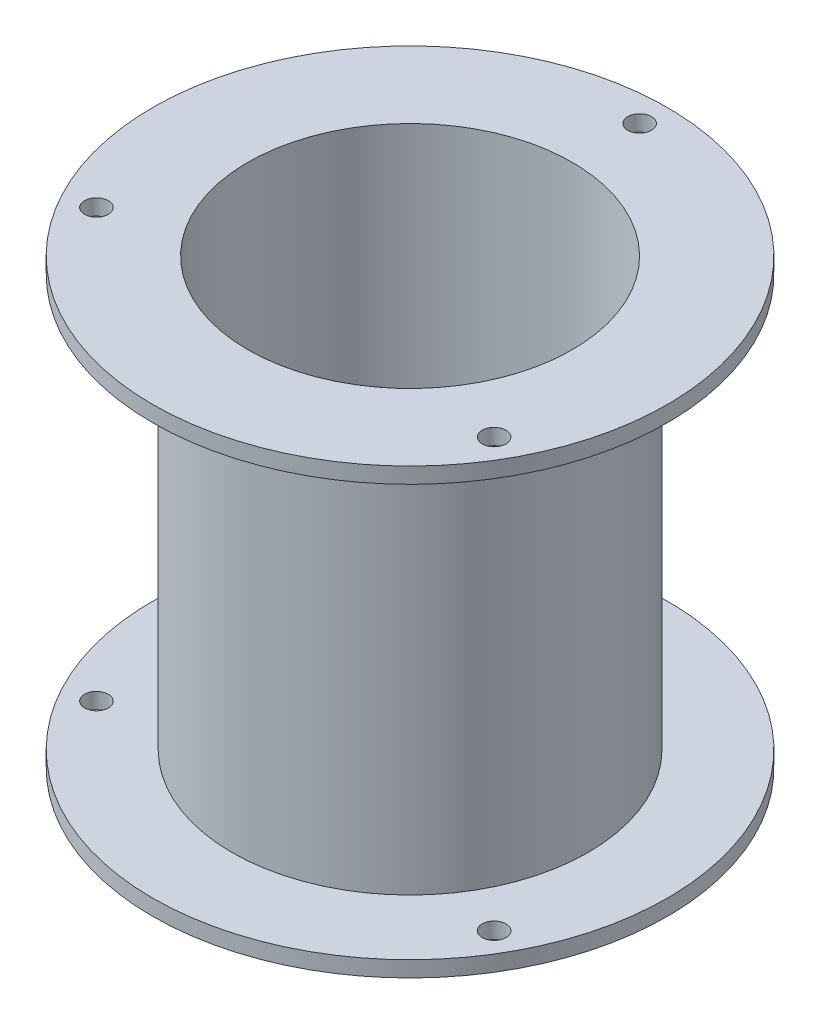
ISO-10303-21;
HEADER;
FILE_DESCRIPTION(('STEP AP214'),'2;1');
FILE_NAME('part.step','',(''),(''),'','','');
FILE_SCHEMA(('AUTOMOTIVE_DESIGN { 1 0 10303 214 1 1 1 1 }'));
ENDSEC;
DATA;
#1=APPLICATION_CONTEXT('core data for automotive mechanical design processes');
#2=APPLICATION_PROTOCOL_DEFINITION('international standard','automotive_design',2000,#1);
#3=PRODUCT_CONTEXT('',#1,'mechanical');
#4=PRODUCT('Part','Part','',(#3));
#5=PRODUCT_RELATED_PRODUCT_CATEGORY('part','',(#4));
#6=PRODUCT_DEFINITION_FORMATION('','',#4);
#7=PRODUCT_DEFINITION_CONTEXT('part definition',#1,'design');
#8=PRODUCT_DEFINITION('design','',#6,#7);
#9=PRODUCT_DEFINITION_SHAPE('','',#8);
#10=(LENGTH_UNIT() NAMED_UNIT(*) SI_UNIT(.MILLI.,.METRE.));
#11=(NAMED_UNIT(*) PLANE_ANGLE_UNIT() SI_UNIT($,.RADIAN.));
#12=(NAMED_UNIT(*) SI_UNIT($,.STERADIAN.) SOLID_ANGLE_UNIT());
#13=UNCERTAINTY_MEASURE_WITH_UNIT(LENGTH_MEASURE(1.E-05),#10,'distance_accuracy_value','');
#14=(GEOMETRIC_REPRESENTATION_CONTEXT(3) GLOBAL_UNCERTAINTY_ASSIGNED_CONTEXT((#13)) GLOBAL_UNIT_ASSIGNED_CONTEXT((#10,
#11,#12)) REPRESENTATION_CONTEXT('',''));
#15=CARTESIAN_POINT('',(0.,0.,0.));
#16=DIRECTION('',(0.,0.,1.));
#17=DIRECTION('',(1.,0.,0.));
#18=AXIS2_PLACEMENT_3D('',#15,#16,#17);
#19=CARTESIAN_POINT('',(0.,56.,0.));
#20=DIRECTION('',(0.,-1.,0.));
#21=DIRECTION('',(0.,0.,-1.));
#22=AXIS2_PLACEMENT_3D('',#19,#20,#21);
#23=CYLINDRICAL_SURFACE('',#22,32.5);
#24=CARTESIAN_POINT('',(0.,54.,0.));
#25=DIRECTION('',(0.,1.,0.));
#26=DIRECTION('',(0.,0.,1.));
#27=AXIS2_PLACEMENT_3D('',#24,#25,#26);
#28=CIRCLE('',#27,32.5);
#29=CARTESIAN_POINT('',(0.,54.,32.5));
#30=VERTEX_POINT('',#29);
#31=EDGE_CURVE('E58',#30,#30,#28,.T.);
#32=ORIENTED_EDGE('',*,*,#31,.T.);
#33=EDGE_LOOP('',(#32));
#34=FACE_BOUND('',#33,.T.);
#35=CARTESIAN_POINT('',(0.,56.,0.));
#36=DIRECTION('',(0.,1.,0.));
#37=DIRECTION('',(0.,0.,1.));
#38=AXIS2_PLACEMENT_3D('',#35,#36,#37);
#39=CIRCLE('',#38,32.5);
#40=CARTESIAN_POINT('',(0.,56.,32.5));
#41=VERTEX_POINT('',#40);
#42=EDGE_CURVE('E11',#41,#41,#39,.T.);
#43=ORIENTED_EDGE('',*,*,#42,.F.);
#44=EDGE_LOOP('',(#43));
#45=FACE_BOUND('',#44,.T.);
#46=ADVANCED_FACE('F43',(#34,#45),#23,.T.);
#47=CARTESIAN_POINT('',(0.,56.,0.));
#48=DIRECTION('',(0.,1.,0.));
#49=DIRECTION('',(0.,0.,1.));
#50=AXIS2_PLACEMENT_3D('',#47,#48,#49);
#51=PLANE('',#50);
#52=CARTESIAN_POINT('',(0.,56.,0.));
#53=DIRECTION('',(0.,1.,0.));
#54=DIRECTION('',(0.,0.,1.));
#55=AXIS2_PLACEMENT_3D('',#52,#53,#54);
#56=CIRCLE('',#55,20.5);
#57=CARTESIAN_POINT('',(0.,56.,20.5));
#58=VERTEX_POINT('',#57);
#59=EDGE_CURVE('E105',#58,#58,#56,.T.);
#60=ORIENTED_EDGE('',*,*,#59,.F.);
#61=EDGE_LOOP('',(#60));
#62=FACE_BOUND('',#61,.T.);
#63=CARTESIAN_POINT('',(0.,56.,-29.));
#64=DIRECTION('',(0.,1.,0.));
#65=DIRECTION('',(0.,0.,1.));
#66=AXIS2_PLACEMENT_3D('',#63,#64,#65);
#67=CIRCLE('',#66,1.5);
#68=CARTESIAN_POINT('',(0.,56.,-27.5));
#69=VERTEX_POINT('',#68);
#70=EDGE_CURVE('E98',#69,#69,#67,.T.);
#71=ORIENTED_EDGE('',*,*,#70,.F.);
#72=EDGE_LOOP('',(#71));
#73=FACE_BOUND('',#72,.T.);
#74=CARTESIAN_POINT('',(-25.1147367097488,56.,14.4999999999999));
#75=DIRECTION('',(0.,1.,0.));
#76=DIRECTION('',(0.,0.,1.));
#77=AXIS2_PLACEMENT_3D('',#74,#75,#76);
#78=CIRCLE('',#77,1.5);
#79=CARTESIAN_POINT('',(-25.1147367097488,56.,15.9999999999999));
#80=VERTEX_POINT('',#79);
#81=EDGE_CURVE('E95',#80,#80,#78,.T.);
#82=ORIENTED_EDGE('',*,*,#81,.F.);
#83=EDGE_LOOP('',(#82));
#84=FACE_BOUND('',#83,.T.);
#85=CARTESIAN_POINT('',(25.1147367097488,56.,14.4999999999999));
#86=DIRECTION('',(0.,1.,0.));
#87=DIRECTION('',(0.,0.,1.));
#88=AXIS2_PLACEMENT_3D('',#85,#86,#87);
#89=CIRCLE('',#88,1.5);
#90=CARTESIAN_POINT('',(25.1147367097488,56.,15.9999999999999));
#91=VERTEX_POINT('',#90);
#92=EDGE_CURVE('E88',#91,#91,#89,.T.);
#93=ORIENTED_EDGE('',*,*,#92,.F.);
#94=EDGE_LOOP('',(#93));
#95=FACE_BOUND('',#94,.T.);
#96=ORIENTED_EDGE('',*,*,#42,.T.);
#97=EDGE_LOOP('',(#96));
#98=FACE_BOUND('',#97,.T.);
#99=ADVANCED_FACE('F111',(#62,#73,#84,#95,#98),#51,.T.);
#100=CARTESIAN_POINT('',(0.,54.,0.));
#101=DIRECTION('',(0.,1.,0.));
#102=DIRECTION('',(0.,0.,1.));
#103=AXIS2_PLACEMENT_3D('',#100,#101,#102);
#104=PLANE('',#103);
#105=CARTESIAN_POINT('',(0.,54.,-29.));
#106=DIRECTION('',(0.,1.,0.));
#107=DIRECTION('',(0.,0.,1.));
#108=AXIS2_PLACEMENT_3D('',#105,#106,#107);
#109=CIRCLE('',#108,1.5);
#110=CARTESIAN_POINT('',(0.,54.,-27.5));
#111=VERTEX_POINT('',#110);
#112=EDGE_CURVE('E64',#111,#111,#109,.T.);
#113=ORIENTED_EDGE('',*,*,#112,.T.);
#114=EDGE_LOOP('',(#113));
#115=FACE_BOUND('',#114,.T.);
#116=CARTESIAN_POINT('',(-25.1147367097488,54.,14.4999999999999));
#117=DIRECTION('',(0.,1.,0.));
#118=DIRECTION('',(0.,0.,1.));
#119=AXIS2_PLACEMENT_3D('',#116,#117,#118);
#120=CIRCLE('',#119,1.5);
#121=CARTESIAN_POINT('',(-25.1147367097488,54.,15.9999999999999));
#122=VERTEX_POINT('',#121);
#123=EDGE_CURVE('E72',#122,#122,#120,.T.);
#124=ORIENTED_EDGE('',*,*,#123,.T.);
#125=EDGE_LOOP('',(#124));
#126=FACE_BOUND('',#125,.T.);
#127=CARTESIAN_POINT('',(25.1147367097488,54.,14.4999999999999));
#128=DIRECTION('',(0.,1.,0.));
#129=DIRECTION('',(0.,0.,1.));
#130=AXIS2_PLACEMENT_3D('',#127,#128,#129);
#131=CIRCLE('',#130,1.5);
#132=CARTESIAN_POINT('',(25.1147367097488,54.,15.9999999999999));
#133=VERTEX_POINT('',#132);
#134=EDGE_CURVE('E78',#133,#133,#131,.T.);
#135=ORIENTED_EDGE('',*,*,#134,.T.);
#136=EDGE_LOOP('',(#135));
#137=FACE_BOUND('',#136,.T.);
#138=CARTESIAN_POINT('',(0.,54.,0.));
#139=DIRECTION('',(0.,1.,0.));
#140=DIRECTION('',(0.,0.,1.));
#141=AXIS2_PLACEMENT_3D('',#138,#139,#140);
#142=CIRCLE('',#141,22.5);
#143=CARTESIAN_POINT('',(0.,54.,22.5));
#144=VERTEX_POINT('',#143);
#145=EDGE_CURVE('E61',#144,#144,#142,.T.);
#146=ORIENTED_EDGE('',*,*,#145,.T.);
#147=EDGE_LOOP('',(#146));
#148=FACE_BOUND('',#147,.T.);
#149=ORIENTED_EDGE('',*,*,#31,.F.);
#150=EDGE_LOOP('',(#149));
#151=FACE_BOUND('',#150,.T.);
#152=ADVANCED_FACE('F114',(#115,#126,#137,#148,#151),#104,.F.);
#153=CARTESIAN_POINT('',(0.,-91.9238815542512,0.));
#154=DIRECTION('',(0.,1.,0.));
#155=DIRECTION('',(0.,0.,1.));
#156=AXIS2_PLACEMENT_3D('',#153,#154,#155);
#157=CYLINDRICAL_SURFACE('',#156,22.5);
#158=CARTESIAN_POINT('',(0.,2.,0.));
#159=DIRECTION('',(0.,1.,0.));
#160=DIRECTION('',(0.,0.,1.));
#161=AXIS2_PLACEMENT_3D('',#158,#159,#160);
#162=CIRCLE('',#161,22.5);
#163=CARTESIAN_POINT('',(0.,1.99999999999999,22.5));
#164=VERTEX_POINT('',#163);
#165=EDGE_CURVE('E53',#164,#164,#162,.F.);
#166=CARTESIAN_POINT('',(0.,1.99999999999999,22.5));
#167=CARTESIAN_POINT('',(0.,2.54166666666665,22.5));
#168=CARTESIAN_POINT('',(0.,3.08333333333332,22.5));
#169=CARTESIAN_POINT('',(0.,4.16666666666666,22.5));
#170=CARTESIAN_POINT('',(0.,4.70833333333332,22.5));
#171=CARTESIAN_POINT('',(0.,5.79166666666666,22.5));
#172=CARTESIAN_POINT('',(0.,6.33333333333333,22.5));
#173=CARTESIAN_POINT('',(0.,7.41666666666666,22.5));
#174=CARTESIAN_POINT('',(0.,7.95833333333333,22.5));
#175=CARTESIAN_POINT('',(0.,9.04166666666666,22.5));
#176=CARTESIAN_POINT('',(0.,9.58333333333333,22.5));
#177=CARTESIAN_POINT('',(0.,10.6666666666667,22.5));
#178=CARTESIAN_POINT('',(0.,11.2083333333333,22.5));
#179=CARTESIAN_POINT('',(0.,12.2916666666667,22.5));
#180=CARTESIAN_POINT('',(0.,12.8333333333333,22.5));
#181=CARTESIAN_POINT('',(0.,13.9166666666667,22.5));
#182=CARTESIAN_POINT('',(0.,14.4583333333333,22.5));
#183=CARTESIAN_POINT('',(0.,15.5416666666667,22.5));
#184=CARTESIAN_POINT('',(0.,16.0833333333333,22.5));
#185=CARTESIAN_POINT('',(0.,17.1666666666667,22.5));
#186=CARTESIAN_POINT('',(0.,17.7083333333333,22.5));
#187=CARTESIAN_POINT('',(0.,18.7916666666667,22.5));
#188=CARTESIAN_POINT('',(0.,19.3333333333333,22.5));
#189=CARTESIAN_POINT('',(0.,20.4166666666667,22.5));
#190=CARTESIAN_POINT('',(0.,20.9583333333333,22.5));
#191=CARTESIAN_POINT('',(0.,22.0416666666667,22.5));
#192=CARTESIAN_POINT('',(0.,22.5833333333333,22.5));
#193=CARTESIAN_POINT('',(0.,23.6666666666667,22.5));
#194=CARTESIAN_POINT('',(0.,24.2083333333333,22.5));
#195=CARTESIAN_POINT('',(0.,25.2916666666667,22.5));
#196=CARTESIAN_POINT('',(0.,25.8333333333333,22.5));
#197=CARTESIAN_POINT('',(0.,26.9166666666667,22.5));
#198=CARTESIAN_POINT('',(0.,27.4583333333333,22.5));
#199=CARTESIAN_POINT('',(0.,28.5416666666667,22.5));
#200=CARTESIAN_POINT('',(0.,29.0833333333333,22.5));
#201=CARTESIAN_POINT('',(0.,30.1666666666667,22.5));
#202=CARTESIAN_POINT('',(0.,30.7083333333333,22.5));
#203=CARTESIAN_POINT('',(0.,31.7916666666667,22.5));
#204=CARTESIAN_POINT('',(0.,32.3333333333333,22.5));
#205=CARTESIAN_POINT('',(0.,33.4166666666667,22.5));
#206=CARTESIAN_POINT('',(0.,33.9583333333333,22.5));
#207=CARTESIAN_POINT('',(0.,35.0416666666667,22.5));
#208=CARTESIAN_POINT('',(0.,35.5833333333333,22.5));
#209=CARTESIAN_POINT('',(0.,36.6666666666667,22.5));
#210=CARTESIAN_POINT('',(0.,37.2083333333333,22.5));
#211=CARTESIAN_POINT('',(0.,38.2916666666667,22.5));
#212=CARTESIAN_POINT('',(0.,38.8333333333333,22.5));
#213=CARTESIAN_POINT('',(0.,39.9166666666667,22.5));
#214=CARTESIAN_POINT('',(0.,40.4583333333333,22.5));
#215=CARTESIAN_POINT('',(0.,41.5416666666667,22.5));
#216=CARTESIAN_POINT('',(0.,42.0833333333333,22.5));
#217=CARTESIAN_POINT('',(0.,43.1666666666667,22.5));
#218=CARTESIAN_POINT('',(0.,43.7083333333333,22.5));
#219=CARTESIAN_POINT('',(0.,44.7916666666667,22.5));
#220=CARTESIAN_POINT('',(0.,45.3333333333334,22.5));
#221=CARTESIAN_POINT('',(0.,46.4166666666667,22.5));
#222=CARTESIAN_POINT('',(0.,46.9583333333333,22.5));
#223=CARTESIAN_POINT('',(0.,48.0416666666667,22.5));
#224=CARTESIAN_POINT('',(0.,48.5833333333333,22.5));
#225=CARTESIAN_POINT('',(0.,49.6666666666667,22.5));
#226=CARTESIAN_POINT('',(0.,50.2083333333333,22.5));
#227=CARTESIAN_POINT('',(0.,51.2916666666667,22.5));
#228=CARTESIAN_POINT('',(0.,51.8333333333334,22.5));
#229=CARTESIAN_POINT('',(0.,52.9166666666667,22.5));
#230=CARTESIAN_POINT('',(0.,53.4583333333334,22.5));
#231=CARTESIAN_POINT('',(0.,54.,22.5));
#232=B_SPLINE_CURVE_WITH_KNOTS('',3,(#166,#167,#168,#169,#170,#171,#172,#173,#174,#175,#176,
#177,#178,#179,#180,#181,#182,#183,#184,#185,#186,#187,#188,#189,#190,#191,#192,#193,#194,#195,
#196,#197,#198,#199,#200,#201,#202,#203,#204,#205,#206,#207,#208,#209,#210,#211,#212,#213,#214,
#215,#216,#217,#218,#219,#220,#221,#222,#223,#224,#225,#226,#227,#228,#229,#230,#231),
.UNSPECIFIED.,.F.,.F.,(4,2,2,2,2,2,2,2,2,2,2,2,2,2,2,2,2,2,2,2,2,2,2,2,2,2,2,2,2,2,2,2,4),(0.,
1.625,3.25,4.875,6.50000000000001,8.12500000000001,9.75000000000001,11.375,13.,14.625,16.25,
17.875,19.5,21.125,22.75,24.375,26.,27.625,29.25,30.875,32.5,34.125,35.75,37.375,39.,40.625,
42.25,43.875,45.5,47.125,48.75,50.375,52.),.UNSPECIFIED.);
#233=EDGE_CURVE('BSEAM133',#164,#144,#232,.T.);
#234=ORIENTED_EDGE('',*,*,#165,.F.);
#235=ORIENTED_EDGE('',*,*,#145,.F.);
#236=ORIENTED_EDGE('',*,*,#233,.T.);
#237=ORIENTED_EDGE('',*,*,#233,.F.);
#238=EDGE_LOOP('',(#234,#236,#235,#237));
#239=FACE_BOUND('',#238,.T.);
#240=ADVANCED_FACE('F133',(#239),#157,.T.);
#241=CARTESIAN_POINT('',(0.,2.,0.));
#242=DIRECTION('',(0.,1.,0.));
#243=DIRECTION('',(0.,0.,1.));
#244=AXIS2_PLACEMENT_3D('',#241,#242,#243);
#245=PLANE('',#244);
#246=CARTESIAN_POINT('',(0.,2.,-29.));
#247=DIRECTION('',(0.,1.,0.));
#248=DIRECTION('',(0.,0.,1.));
#249=AXIS2_PLACEMENT_3D('',#246,#247,#248);
#250=CIRCLE('',#249,1.5);
#251=CARTESIAN_POINT('',(0.,2.,-27.5));
#252=VERTEX_POINT('',#251);
#253=EDGE_CURVE('E69',#252,#252,#250,.T.);
#254=ORIENTED_EDGE('',*,*,#253,.F.);
#255=EDGE_LOOP('',(#254));
#256=FACE_BOUND('',#255,.T.);
#257=CARTESIAN_POINT('',(-25.1147367097488,2.,14.4999999999999));
#258=DIRECTION('',(0.,1.,0.));
#259=DIRECTION('',(0.,0.,1.));
#260=AXIS2_PLACEMENT_3D('',#257,#258,#259);
#261=CIRCLE('',#260,1.5);
#262=CARTESIAN_POINT('',(-25.1147367097488,2.,15.9999999999999));
#263=VERTEX_POINT('',#262);
#264=EDGE_CURVE('E75',#263,#263,#261,.T.);
#265=ORIENTED_EDGE('',*,*,#264,.F.);
#266=EDGE_LOOP('',(#265));
#267=FACE_BOUND('',#266,.T.);
#268=CARTESIAN_POINT('',(25.1147367097488,2.,14.4999999999999));
#269=DIRECTION('',(0.,1.,0.));
#270=DIRECTION('',(0.,0.,1.));
#271=AXIS2_PLACEMENT_3D('',#268,#269,#270);
#272=CIRCLE('',#271,1.5);
#273=CARTESIAN_POINT('',(25.1147367097488,2.,15.9999999999999));
#274=VERTEX_POINT('',#273);
#275=EDGE_CURVE('E81',#274,#274,#272,.T.);
#276=ORIENTED_EDGE('',*,*,#275,.F.);
#277=EDGE_LOOP('',(#276));
#278=FACE_BOUND('',#277,.T.);
#279=CARTESIAN_POINT('',(0.,2.,0.));
#280=DIRECTION('',(0.,1.,0.));
#281=DIRECTION('',(0.,0.,1.));
#282=AXIS2_PLACEMENT_3D('',#279,#280,#281);
#283=CIRCLE('',#282,32.5);
#284=CARTESIAN_POINT('',(0.,2.,32.5));
#285=VERTEX_POINT('',#284);
#286=EDGE_CURVE('E57',#285,#285,#283,.F.);
#287=ORIENTED_EDGE('',*,*,#286,.F.);
#288=EDGE_LOOP('',(#287));
#289=FACE_BOUND('',#288,.T.);
#290=ORIENTED_EDGE('',*,*,#165,.T.);
#291=EDGE_LOOP('',(#290));
#292=FACE_BOUND('',#291,.T.);
#293=ADVANCED_FACE('F155',(#256,#267,#278,#289,#292),#245,.T.);
#294=CARTESIAN_POINT('',(0.,0.,0.));
#295=DIRECTION('',(0.,1.,0.));
#296=DIRECTION('',(0.,0.,1.));
#297=AXIS2_PLACEMENT_3D('',#294,#295,#296);
#298=PLANE('',#297);
#299=CARTESIAN_POINT('',(0.,0.,0.));
#300=DIRECTION('',(0.,1.,0.));
#301=DIRECTION('',(0.,0.,1.));
#302=AXIS2_PLACEMENT_3D('',#299,#300,#301);
#303=CIRCLE('',#302,20.5);
#304=CARTESIAN_POINT('',(0.,0.,20.5));
#305=VERTEX_POINT('',#304);
#306=EDGE_CURVE('E89',#305,#305,#303,.F.);
#307=ORIENTED_EDGE('',*,*,#306,.F.);
#308=EDGE_LOOP('',(#307));
#309=FACE_BOUND('',#308,.T.);
#310=CARTESIAN_POINT('',(0.,0.,-29.));
#311=DIRECTION('',(0.,1.,0.));
#312=DIRECTION('',(0.,0.,1.));
#313=AXIS2_PLACEMENT_3D('',#310,#311,#312);
#314=CIRCLE('',#313,1.5);
#315=CARTESIAN_POINT('',(0.,0.,-27.5));
#316=VERTEX_POINT('',#315);
#317=EDGE_CURVE('E84',#316,#316,#314,.T.);
#318=ORIENTED_EDGE('',*,*,#317,.T.);
#319=EDGE_LOOP('',(#318));
#320=FACE_BOUND('',#319,.T.);
#321=CARTESIAN_POINT('',(-25.1147367097488,0.,14.4999999999999));
#322=DIRECTION('',(0.,1.,0.));
#323=DIRECTION('',(0.,0.,1.));
#324=AXIS2_PLACEMENT_3D('',#321,#322,#323);
#325=CIRCLE('',#324,1.5);
#326=CARTESIAN_POINT('',(-25.1147367097488,0.,15.9999999999999));
#327=VERTEX_POINT('',#326);
#328=EDGE_CURVE('E92',#327,#327,#325,.T.);
#329=ORIENTED_EDGE('',*,*,#328,.T.);
#330=EDGE_LOOP('',(#329));
#331=FACE_BOUND('',#330,.T.);
#332=CARTESIAN_POINT('',(25.1147367097488,0.,14.4999999999999));
#333=DIRECTION('',(0.,1.,0.));
#334=DIRECTION('',(0.,0.,1.));
#335=AXIS2_PLACEMENT_3D('',#332,#333,#334);
#336=CIRCLE('',#335,1.5);
#337=CARTESIAN_POINT('',(25.1147367097488,0.,15.9999999999999));
#338=VERTEX_POINT('',#337);
#339=EDGE_CURVE('E85',#338,#338,#336,.T.);
#340=ORIENTED_EDGE('',*,*,#339,.T.);
#341=EDGE_LOOP('',(#340));
#342=FACE_BOUND('',#341,.T.);
#343=CARTESIAN_POINT('',(0.,0.,0.));
#344=DIRECTION('',(0.,1.,0.));
#345=DIRECTION('',(0.,0.,1.));
#346=AXIS2_PLACEMENT_3D('',#343,#344,#345);
#347=CIRCLE('',#346,32.5);
#348=CARTESIAN_POINT('',(0.,0.,32.5));
#349=VERTEX_POINT('',#348);
#350=EDGE_CURVE('E46',#349,#349,#347,.T.);
#351=ORIENTED_EDGE('',*,*,#350,.F.);
#352=EDGE_LOOP('',(#351));
#353=FACE_BOUND('',#352,.T.);
#354=ADVANCED_FACE('F147',(#309,#320,#331,#342,#353),#298,.F.);
#355=ORIENTED_EDGE('',*,*,#350,.T.);
#356=EDGE_LOOP('',(#355));
#357=FACE_BOUND('',#356,.T.);
#358=ORIENTED_EDGE('',*,*,#286,.T.);
#359=EDGE_LOOP('',(#358));
#360=FACE_BOUND('',#359,.T.);
#361=ADVANCED_FACE('F142',(#357,#360),#23,.T.);
#362=CARTESIAN_POINT('',(25.1147367097488,0.,14.4999999999999));
#363=DIRECTION('',(0.,1.,0.));
#364=DIRECTION('',(0.,0.,1.));
#365=AXIS2_PLACEMENT_3D('',#362,#363,#364);
#366=CYLINDRICAL_SURFACE('',#365,1.5);
#367=ORIENTED_EDGE('',*,*,#275,.T.);
#368=EDGE_LOOP('',(#367));
#369=FACE_BOUND('',#368,.T.);
#370=ORIENTED_EDGE('',*,*,#339,.F.);
#371=EDGE_LOOP('',(#370));
#372=FACE_BOUND('',#371,.T.);
#373=ADVANCED_FACE('F128',(#369,#372),#366,.F.);
#374=CARTESIAN_POINT('',(-25.1147367097488,0.,14.4999999999999));
#375=DIRECTION('',(0.,1.,0.));
#376=DIRECTION('',(0.,0.,1.));
#377=AXIS2_PLACEMENT_3D('',#374,#375,#376);
#378=CYLINDRICAL_SURFACE('',#377,1.5);
#379=ORIENTED_EDGE('',*,*,#264,.T.);
#380=EDGE_LOOP('',(#379));
#381=FACE_BOUND('',#380,.T.);
#382=ORIENTED_EDGE('',*,*,#328,.F.);
#383=EDGE_LOOP('',(#382));
#384=FACE_BOUND('',#383,.T.);
#385=ADVANCED_FACE('F152',(#381,#384),#378,.F.);
#386=CARTESIAN_POINT('',(0.,0.,-29.));
#387=DIRECTION('',(0.,1.,0.));
#388=DIRECTION('',(0.,0.,1.));
#389=AXIS2_PLACEMENT_3D('',#386,#387,#388);
#390=CYLINDRICAL_SURFACE('',#389,1.5);
#391=ORIENTED_EDGE('',*,*,#253,.T.);
#392=EDGE_LOOP('',(#391));
#393=FACE_BOUND('',#392,.T.);
#394=ORIENTED_EDGE('',*,*,#317,.F.);
#395=EDGE_LOOP('',(#394));
#396=FACE_BOUND('',#395,.T.);
#397=ADVANCED_FACE('F126',(#393,#396),#390,.F.);
#398=ORIENTED_EDGE('',*,*,#92,.T.);
#399=EDGE_LOOP('',(#398));
#400=FACE_BOUND('',#399,.T.);
#401=ORIENTED_EDGE('',*,*,#134,.F.);
#402=EDGE_LOOP('',(#401));
#403=FACE_BOUND('',#402,.T.);
#404=ADVANCED_FACE('F122',(#400,#403),#366,.F.);
#405=ORIENTED_EDGE('',*,*,#81,.T.);
#406=EDGE_LOOP('',(#405));
#407=FACE_BOUND('',#406,.T.);
#408=ORIENTED_EDGE('',*,*,#123,.F.);
#409=EDGE_LOOP('',(#408));
#410=FACE_BOUND('',#409,.T.);
#411=ADVANCED_FACE('F125',(#407,#410),#378,.F.);
#412=ORIENTED_EDGE('',*,*,#70,.T.);
#413=EDGE_LOOP('',(#412));
#414=FACE_BOUND('',#413,.T.);
#415=ORIENTED_EDGE('',*,*,#112,.F.);
#416=EDGE_LOOP('',(#415));
#417=FACE_BOUND('',#416,.T.);
#418=ADVANCED_FACE('F178',(#414,#417),#390,.F.);
#419=CARTESIAN_POINT('',(0.,-91.9238815542512,0.));
#420=DIRECTION('',(0.,1.,0.));
#421=DIRECTION('',(0.,0.,1.));
#422=AXIS2_PLACEMENT_3D('',#419,#420,#421);
#423=CYLINDRICAL_SURFACE('',#422,20.5);
#424=CARTESIAN_POINT('',(0.,0.,20.5));
#425=CARTESIAN_POINT('',(0.,0.583333333333319,20.5));
#426=CARTESIAN_POINT('',(0.,1.16666666666665,20.5));
#427=CARTESIAN_POINT('',(0.,2.33333333333332,20.5));
#428=CARTESIAN_POINT('',(0.,2.91666666666666,20.5));
#429=CARTESIAN_POINT('',(0.,4.08333333333332,20.5));
#430=CARTESIAN_POINT('',(0.,4.66666666666666,20.5));
#431=CARTESIAN_POINT('',(0.,5.83333333333332,20.5));
#432=CARTESIAN_POINT('',(0.,6.41666666666666,20.5));
#433=CARTESIAN_POINT('',(0.,7.58333333333332,20.5));
#434=CARTESIAN_POINT('',(0.,8.16666666666665,20.5));
#435=CARTESIAN_POINT('',(0.,9.33333333333331,20.5));
#436=CARTESIAN_POINT('',(0.,9.91666666666665,20.5));
#437=CARTESIAN_POINT('',(0.,11.0833333333333,20.5));
#438=CARTESIAN_POINT('',(0.,11.6666666666667,20.5));
#439=CARTESIAN_POINT('',(0.,12.8333333333333,20.5));
#440=CARTESIAN_POINT('',(0.,13.4166666666667,20.5));
#441=CARTESIAN_POINT('',(0.,14.5833333333333,20.5));
#442=CARTESIAN_POINT('',(0.,15.1666666666667,20.5));
#443=CARTESIAN_POINT('',(0.,16.3333333333333,20.5));
#444=CARTESIAN_POINT('',(0.,16.9166666666667,20.5));
#445=CARTESIAN_POINT('',(0.,18.0833333333333,20.5));
#446=CARTESIAN_POINT('',(0.,18.6666666666666,20.5));
#447=CARTESIAN_POINT('',(0.,19.8333333333333,20.5));
#448=CARTESIAN_POINT('',(0.,20.4166666666666,20.5));
#449=CARTESIAN_POINT('',(0.,21.5833333333333,20.5));
#450=CARTESIAN_POINT('',(0.,22.1666666666666,20.5));
#451=CARTESIAN_POINT('',(0.,23.3333333333333,20.5));
#452=CARTESIAN_POINT('',(0.,23.9166666666666,20.5));
#453=CARTESIAN_POINT('',(0.,25.0833333333333,20.5));
#454=CARTESIAN_POINT('',(0.,25.6666666666666,20.5));
#455=CARTESIAN_POINT('',(0.,26.8333333333333,20.5));
#456=CARTESIAN_POINT('',(0.,27.4166666666666,20.5));
#457=CARTESIAN_POINT('',(0.,28.5833333333333,20.5));
#458=CARTESIAN_POINT('',(0.,29.1666666666667,20.5));
#459=CARTESIAN_POINT('',(0.,30.3333333333333,20.5));
#460=CARTESIAN_POINT('',(0.,30.9166666666667,20.5));
#461=CARTESIAN_POINT('',(0.,32.0833333333333,20.5));
#462=CARTESIAN_POINT('',(0.,32.6666666666666,20.5));
#463=CARTESIAN_POINT('',(0.,33.8333333333333,20.5));
#464=CARTESIAN_POINT('',(0.,34.4166666666666,20.5));
#465=CARTESIAN_POINT('',(0.,35.5833333333333,20.5));
#466=CARTESIAN_POINT('',(0.,36.1666666666666,20.5));
#467=CARTESIAN_POINT('',(0.,37.3333333333333,20.5));
#468=CARTESIAN_POINT('',(0.,37.9166666666666,20.5));
#469=CARTESIAN_POINT('',(0.,39.0833333333333,20.5));
#470=CARTESIAN_POINT('',(0.,39.6666666666666,20.5));
#471=CARTESIAN_POINT('',(0.,40.8333333333333,20.5));
#472=CARTESIAN_POINT('',(0.,41.4166666666666,20.5));
#473=CARTESIAN_POINT('',(0.,42.5833333333333,20.5));
#474=CARTESIAN_POINT('',(0.,43.1666666666666,20.5));
#475=CARTESIAN_POINT('',(0.,44.3333333333333,20.5));
#476=CARTESIAN_POINT('',(0.,44.9166666666666,20.5));
#477=CARTESIAN_POINT('',(0.,46.0833333333333,20.5));
#478=CARTESIAN_POINT('',(0.,46.6666666666666,20.5));
#479=CARTESIAN_POINT('',(0.,47.8333333333333,20.5));
#480=CARTESIAN_POINT('',(0.,48.4166666666666,20.5));
#481=CARTESIAN_POINT('',(0.,49.5833333333333,20.5));
#482=CARTESIAN_POINT('',(0.,50.1666666666666,20.5));
#483=CARTESIAN_POINT('',(0.,51.3333333333333,20.5));
#484=CARTESIAN_POINT('',(0.,51.9166666666666,20.5));
#485=CARTESIAN_POINT('',(0.,53.0833333333333,20.5));
#486=CARTESIAN_POINT('',(0.,53.6666666666666,20.5));
#487=CARTESIAN_POINT('',(0.,54.8333333333333,20.5));
#488=CARTESIAN_POINT('',(0.,55.4166666666666,20.5));
#489=CARTESIAN_POINT('',(0.,56.,20.5));
#490=B_SPLINE_CURVE_WITH_KNOTS('',3,(#424,#425,#426,#427,#428,#429,#430,#431,#432,#433,#434,
#435,#436,#437,#438,#439,#440,#441,#442,#443,#444,#445,#446,#447,#448,#449,#450,#451,#452,#453,
#454,#455,#456,#457,#458,#459,#460,#461,#462,#463,#464,#465,#466,#467,#468,#469,#470,#471,#472,
#473,#474,#475,#476,#477,#478,#479,#480,#481,#482,#483,#484,#485,#486,#487,#488,#489),
.UNSPECIFIED.,.F.,.F.,(4,2,2,2,2,2,2,2,2,2,2,2,2,2,2,2,2,2,2,2,2,2,2,2,2,2,2,2,2,2,2,2,4),(0.,
1.75,3.5,5.25,7.00000000000001,8.74999999999999,10.5,12.25,14.,15.75,17.5,19.25,21.,22.75,24.5,
26.25,28.,29.75,31.5,33.25,35.,36.75,38.5,40.25,42.,43.75,45.5,47.25,49.,50.75,52.5,54.25,56.),.UNSPECIFIED.);
#491=EDGE_CURVE('BSEAM109',#305,#58,#490,.T.);
#492=ORIENTED_EDGE('',*,*,#306,.T.);
#493=ORIENTED_EDGE('',*,*,#59,.T.);
#494=ORIENTED_EDGE('',*,*,#491,.T.);
#495=ORIENTED_EDGE('',*,*,#491,.F.);
#496=EDGE_LOOP('',(#492,#494,#493,#495));
#497=FACE_BOUND('',#496,.T.);
#498=ADVANCED_FACE('F109',(#497),#423,.F.);
#499=CLOSED_SHELL('',(#46,#99,#152,#240,#293,#354,#361,#373,#385,#397,#404,#411,#418,#498));
#500=MANIFOLD_SOLID_BREP('B2',#499);
#501=ADVANCED_BREP_SHAPE_REPRESENTATION('',(#18,#500),#14);
#502=SHAPE_DEFINITION_REPRESENTATION(#9,#501);
ENDSEC;
END-ISO-10303-21;
